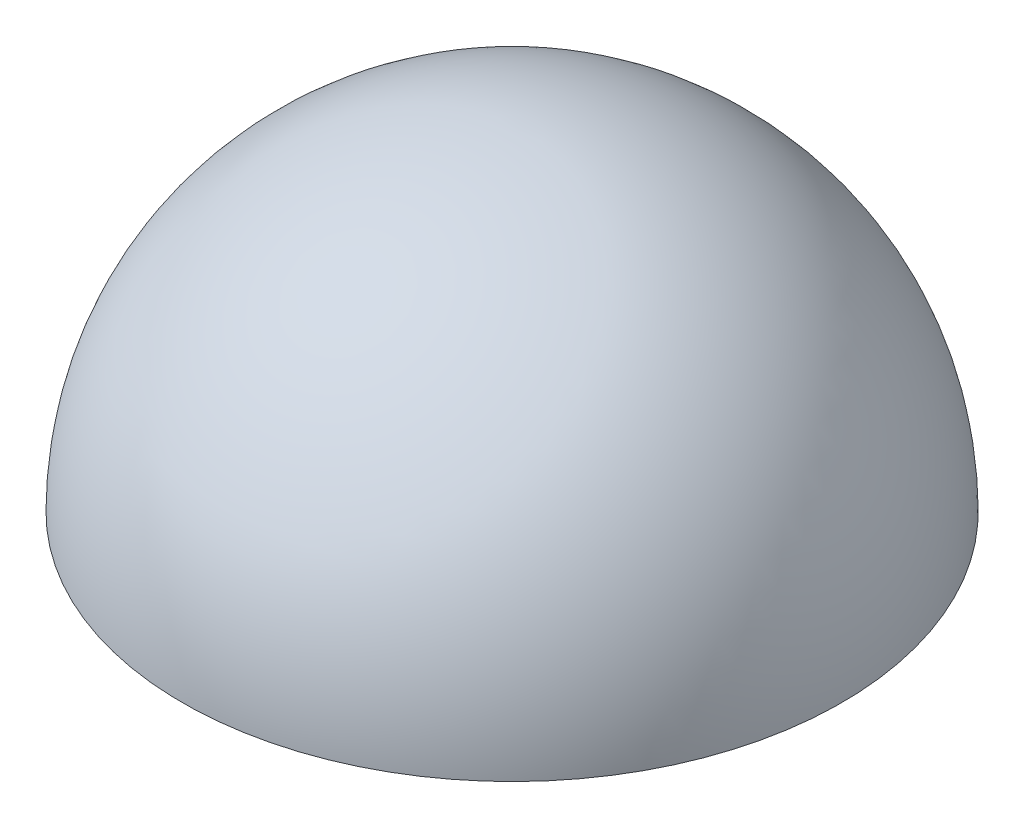
ISO-10303-21;
HEADER;
FILE_DESCRIPTION(('STEP AP214'),'2;1');
FILE_NAME('part.step','',(''),(''),'','','');
FILE_SCHEMA(('AUTOMOTIVE_DESIGN { 1 0 10303 214 1 1 1 1 }'));
ENDSEC;
DATA;
#1=APPLICATION_CONTEXT('core data for automotive mechanical design processes');
#2=APPLICATION_PROTOCOL_DEFINITION('international standard','automotive_design',2000,#1);
#3=PRODUCT_CONTEXT('',#1,'mechanical');
#4=PRODUCT('Part','Part','',(#3));
#5=PRODUCT_RELATED_PRODUCT_CATEGORY('part','',(#4));
#6=PRODUCT_DEFINITION_FORMATION('','',#4);
#7=PRODUCT_DEFINITION_CONTEXT('part definition',#1,'design');
#8=PRODUCT_DEFINITION('design','',#6,#7);
#9=PRODUCT_DEFINITION_SHAPE('','',#8);
#10=(LENGTH_UNIT() NAMED_UNIT(*) SI_UNIT(.MILLI.,.METRE.));
#11=(NAMED_UNIT(*) PLANE_ANGLE_UNIT() SI_UNIT($,.RADIAN.));
#12=(NAMED_UNIT(*) SI_UNIT($,.STERADIAN.) SOLID_ANGLE_UNIT());
#13=UNCERTAINTY_MEASURE_WITH_UNIT(LENGTH_MEASURE(1.E-05),#10,'distance_accuracy_value','');
#14=(GEOMETRIC_REPRESENTATION_CONTEXT(3) GLOBAL_UNCERTAINTY_ASSIGNED_CONTEXT((#13)) GLOBAL_UNIT_ASSIGNED_CONTEXT((#10,
#11,#12)) REPRESENTATION_CONTEXT('',''));
#15=CARTESIAN_POINT('',(0.,0.,0.));
#16=DIRECTION('',(0.,0.,1.));
#17=DIRECTION('',(1.,0.,0.));
#18=AXIS2_PLACEMENT_3D('',#15,#16,#17);
#19=CARTESIAN_POINT('',(0.,0.,0.));
#20=DIRECTION('',(-1.,0.,0.));
#21=DIRECTION('',(0.,0.,1.));
#22=AXIS2_PLACEMENT_3D('',#19,#20,#21);
#23=SPHERICAL_SURFACE('',#22,10.);
#24=CARTESIAN_POINT('',(0.,0.,0.));
#25=DIRECTION('',(0.,-1.,0.));
#26=DIRECTION('',(0.,0.,-1.));
#27=AXIS2_PLACEMENT_3D('',#24,#25,#26);
#28=SPHERICAL_SURFACE('',#27,10.);
#29=CARTESIAN_POINT('',(0.,0.,0.));
#30=DIRECTION('',(0.,-1.,0.));
#31=DIRECTION('',(0.,0.,-1.));
#32=AXIS2_PLACEMENT_3D('',#29,#30,#31);
#33=CIRCLE('',#32,10.);
#34=CARTESIAN_POINT('',(0.,0.,-10.));
#35=VERTEX_POINT('',#34);
#36=EDGE_CURVE('E10',#35,#35,#33,.T.);
#37=ORIENTED_EDGE('',*,*,#36,.F.);
#38=EDGE_LOOP('',(#37));
#39=FACE_BOUND('',#38,.T.);
#40=ADVANCED_FACE('F35',(#39),#28,.T.);
#41=CARTESIAN_POINT('',(0.,0.,0.));
#42=DIRECTION('',(0.,-1.,0.));
#43=DIRECTION('',(0.,0.,-1.));
#44=AXIS2_PLACEMENT_3D('',#41,#42,#43);
#45=PLANE('',#44);
#46=CARTESIAN_POINT('',(0.,0.,0.));
#47=DIRECTION('',(0.,-1.,0.));
#48=DIRECTION('',(0.,0.,-1.));
#49=AXIS2_PLACEMENT_3D('',#46,#47,#48);
#50=CIRCLE('',#49,4.);
#51=CARTESIAN_POINT('',(0.,0.,-4.));
#52=VERTEX_POINT('',#51);
#53=EDGE_CURVE('E45',#52,#52,#50,.T.);
#54=ORIENTED_EDGE('',*,*,#53,.F.);
#55=EDGE_LOOP('',(#54));
#56=FACE_BOUND('',#55,.T.);
#57=ORIENTED_EDGE('',*,*,#36,.T.);
#58=EDGE_LOOP('',(#57));
#59=FACE_BOUND('',#58,.T.);
#60=ADVANCED_FACE('F54',(#56,#59),#45,.T.);
#61=CARTESIAN_POINT('',(0.,5.,0.));
#62=DIRECTION('',(0.,-1.,0.));
#63=DIRECTION('',(0.,0.,-1.));
#64=AXIS2_PLACEMENT_3D('',#61,#62,#63);
#65=CYLINDRICAL_SURFACE('',#64,4.);
#66=CARTESIAN_POINT('',(0.,5.,0.));
#67=DIRECTION('',(0.,-1.,0.));
#68=DIRECTION('',(0.,0.,-1.));
#69=AXIS2_PLACEMENT_3D('',#66,#67,#68);
#70=CIRCLE('',#69,4.);
#71=CARTESIAN_POINT('',(0.,5.00000000000003,-3.99999999999997));
#72=VERTEX_POINT('',#71);
#73=EDGE_CURVE('E41',#72,#72,#70,.T.);
#74=ORIENTED_EDGE('',*,*,#73,.F.);
#75=EDGE_LOOP('',(#74));
#76=FACE_BOUND('',#75,.T.);
#77=ORIENTED_EDGE('',*,*,#53,.T.);
#78=EDGE_LOOP('',(#77));
#79=FACE_BOUND('',#78,.T.);
#80=ADVANCED_FACE('F52',(#76,#79),#65,.F.);
#81=CARTESIAN_POINT('',(0.,5.,0.));
#82=DIRECTION('',(0.,-1.,0.));
#83=DIRECTION('',(0.,0.,-1.));
#84=AXIS2_PLACEMENT_3D('',#81,#82,#83);
#85=PLANE('',#84);
#86=ORIENTED_EDGE('',*,*,#73,.T.);
#87=EDGE_LOOP('',(#86));
#88=FACE_BOUND('',#87,.T.);
#89=ADVANCED_FACE('F60',(#88),#85,.T.);
#90=CLOSED_SHELL('',(#40,#60,#80,#89));
#91=MANIFOLD_SOLID_BREP('B2',#90);
#92=ADVANCED_BREP_SHAPE_REPRESENTATION('',(#18,#91),#14);
#93=SHAPE_DEFINITION_REPRESENTATION(#9,#92);
ENDSEC;
END-ISO-10303-21;
